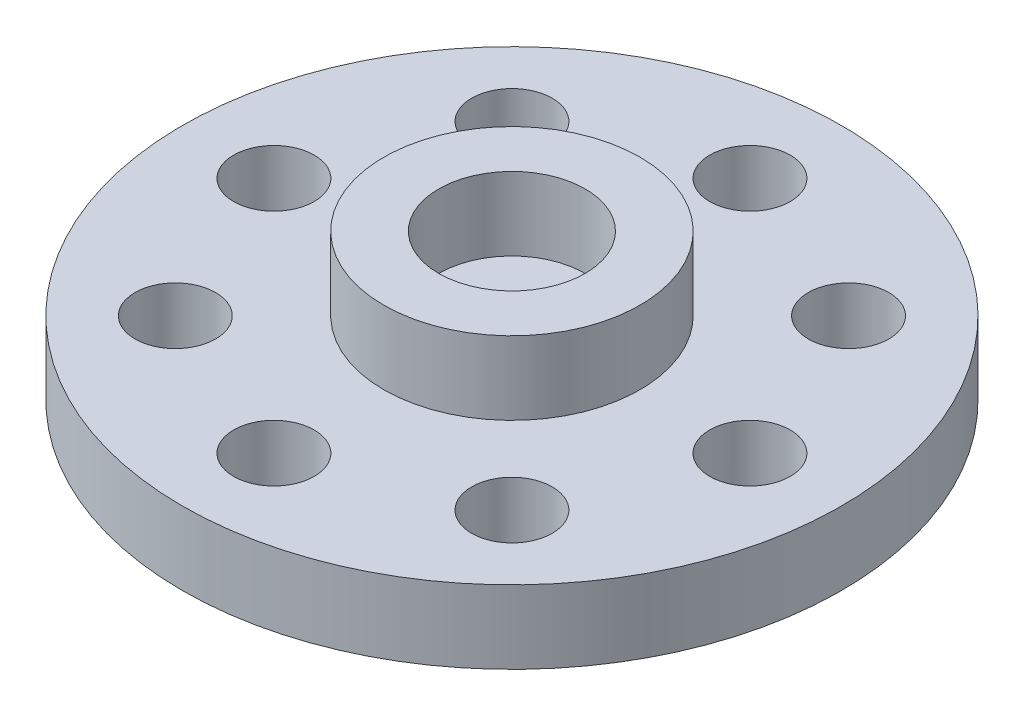
ISO-10303-21;
HEADER;
FILE_DESCRIPTION(('STEP AP214'),'2;1');
FILE_NAME('part.step','',(''),(''),'','','');
FILE_SCHEMA(('AUTOMOTIVE_DESIGN { 1 0 10303 214 1 1 1 1 }'));
ENDSEC;
DATA;
#1=APPLICATION_CONTEXT('core data for automotive mechanical design processes');
#2=APPLICATION_PROTOCOL_DEFINITION('international standard','automotive_design',2000,#1);
#3=PRODUCT_CONTEXT('',#1,'mechanical');
#4=PRODUCT('Part','Part','',(#3));
#5=PRODUCT_RELATED_PRODUCT_CATEGORY('part','',(#4));
#6=PRODUCT_DEFINITION_FORMATION('','',#4);
#7=PRODUCT_DEFINITION_CONTEXT('part definition',#1,'design');
#8=PRODUCT_DEFINITION('design','',#6,#7);
#9=PRODUCT_DEFINITION_SHAPE('','',#8);
#10=(LENGTH_UNIT() NAMED_UNIT(*) SI_UNIT(.MILLI.,.METRE.));
#11=(NAMED_UNIT(*) PLANE_ANGLE_UNIT() SI_UNIT($,.RADIAN.));
#12=(NAMED_UNIT(*) SI_UNIT($,.STERADIAN.) SOLID_ANGLE_UNIT());
#13=UNCERTAINTY_MEASURE_WITH_UNIT(LENGTH_MEASURE(1.E-05),#10,'distance_accuracy_value','');
#14=(GEOMETRIC_REPRESENTATION_CONTEXT(3) GLOBAL_UNCERTAINTY_ASSIGNED_CONTEXT((#13)) GLOBAL_UNIT_ASSIGNED_CONTEXT((#10,
#11,#12)) REPRESENTATION_CONTEXT('',''));
#15=CARTESIAN_POINT('',(0.,0.,0.));
#16=DIRECTION('',(0.,0.,1.));
#17=DIRECTION('',(1.,0.,0.));
#18=AXIS2_PLACEMENT_3D('',#15,#16,#17);
#19=CARTESIAN_POINT('',(0.,2.,0.));
#20=DIRECTION('',(0.,-1.,0.));
#21=DIRECTION('',(0.,0.,-1.));
#22=AXIS2_PLACEMENT_3D('',#19,#20,#21);
#23=CYLINDRICAL_SURFACE('',#22,9.);
#24=CARTESIAN_POINT('',(0.,2.,0.));
#25=DIRECTION('',(0.,1.,0.));
#26=DIRECTION('',(0.,0.,1.));
#27=AXIS2_PLACEMENT_3D('',#24,#25,#26);
#28=CIRCLE('',#27,9.);
#29=CARTESIAN_POINT('',(0.,2.,9.));
#30=VERTEX_POINT('',#29);
#31=EDGE_CURVE('E48',#30,#30,#28,.T.);
#32=ORIENTED_EDGE('',*,*,#31,.F.);
#33=EDGE_LOOP('',(#32));
#34=FACE_BOUND('',#33,.T.);
#35=CARTESIAN_POINT('',(0.,0.,0.));
#36=DIRECTION('',(0.,1.,0.));
#37=DIRECTION('',(0.,0.,1.));
#38=AXIS2_PLACEMENT_3D('',#35,#36,#37);
#39=CIRCLE('',#38,9.);
#40=CARTESIAN_POINT('',(0.,0.,9.));
#41=VERTEX_POINT('',#40);
#42=EDGE_CURVE('E53',#41,#41,#39,.T.);
#43=ORIENTED_EDGE('',*,*,#42,.T.);
#44=EDGE_LOOP('',(#43));
#45=FACE_BOUND('',#44,.T.);
#46=ADVANCED_FACE('F41',(#34,#45),#23,.T.);
#47=CARTESIAN_POINT('',(0.,2.,0.));
#48=DIRECTION('',(0.,1.,0.));
#49=DIRECTION('',(0.,0.,1.));
#50=AXIS2_PLACEMENT_3D('',#47,#48,#49);
#51=PLANE('',#50);
#52=CARTESIAN_POINT('',(-4.59619407771256,2.,4.59619407771256));
#53=DIRECTION('',(0.,1.,0.));
#54=DIRECTION('',(0.,0.,1.));
#55=AXIS2_PLACEMENT_3D('',#52,#53,#54);
#56=CIRCLE('',#55,1.1);
#57=CARTESIAN_POINT('',(-4.59619407771256,2.,5.69619407771256));
#58=VERTEX_POINT('',#57);
#59=EDGE_CURVE('E72',#58,#58,#56,.T.);
#60=ORIENTED_EDGE('',*,*,#59,.F.);
#61=EDGE_LOOP('',(#60));
#62=FACE_BOUND('',#61,.T.);
#63=CARTESIAN_POINT('',(-6.5,2.,0.));
#64=DIRECTION('',(0.,1.,0.));
#65=DIRECTION('',(0.,0.,1.));
#66=AXIS2_PLACEMENT_3D('',#63,#64,#65);
#67=CIRCLE('',#66,1.1);
#68=CARTESIAN_POINT('',(-6.5,2.,1.1));
#69=VERTEX_POINT('',#68);
#70=EDGE_CURVE('E76',#69,#69,#67,.T.);
#71=ORIENTED_EDGE('',*,*,#70,.F.);
#72=EDGE_LOOP('',(#71));
#73=FACE_BOUND('',#72,.T.);
#74=CARTESIAN_POINT('',(-4.59619407771256,2.,-4.59619407771256));
#75=DIRECTION('',(0.,1.,0.));
#76=DIRECTION('',(0.,0.,1.));
#77=AXIS2_PLACEMENT_3D('',#74,#75,#76);
#78=CIRCLE('',#77,1.1);
#79=CARTESIAN_POINT('',(-4.59619407771256,2.,-3.49619407771256));
#80=VERTEX_POINT('',#79);
#81=EDGE_CURVE('E80',#80,#80,#78,.T.);
#82=ORIENTED_EDGE('',*,*,#81,.F.);
#83=EDGE_LOOP('',(#82));
#84=FACE_BOUND('',#83,.T.);
#85=CARTESIAN_POINT('',(0.,2.,-6.5));
#86=DIRECTION('',(0.,1.,0.));
#87=DIRECTION('',(0.,0.,1.));
#88=AXIS2_PLACEMENT_3D('',#85,#86,#87);
#89=CIRCLE('',#88,1.1);
#90=CARTESIAN_POINT('',(0.,2.,-5.4));
#91=VERTEX_POINT('',#90);
#92=EDGE_CURVE('E84',#91,#91,#89,.T.);
#93=ORIENTED_EDGE('',*,*,#92,.F.);
#94=EDGE_LOOP('',(#93));
#95=FACE_BOUND('',#94,.T.);
#96=CARTESIAN_POINT('',(4.59619407771256,2.,-4.59619407771256));
#97=DIRECTION('',(0.,1.,0.));
#98=DIRECTION('',(0.,0.,1.));
#99=AXIS2_PLACEMENT_3D('',#96,#97,#98);
#100=CIRCLE('',#99,1.1);
#101=CARTESIAN_POINT('',(4.59619407771256,2.,-3.49619407771256));
#102=VERTEX_POINT('',#101);
#103=EDGE_CURVE('E88',#102,#102,#100,.T.);
#104=ORIENTED_EDGE('',*,*,#103,.F.);
#105=EDGE_LOOP('',(#104));
#106=FACE_BOUND('',#105,.T.);
#107=CARTESIAN_POINT('',(6.5,2.,0.));
#108=DIRECTION('',(0.,1.,0.));
#109=DIRECTION('',(0.,0.,1.));
#110=AXIS2_PLACEMENT_3D('',#107,#108,#109);
#111=CIRCLE('',#110,1.1);
#112=CARTESIAN_POINT('',(6.5,2.,1.1));
#113=VERTEX_POINT('',#112);
#114=EDGE_CURVE('E92',#113,#113,#111,.T.);
#115=ORIENTED_EDGE('',*,*,#114,.F.);
#116=EDGE_LOOP('',(#115));
#117=FACE_BOUND('',#116,.T.);
#118=CARTESIAN_POINT('',(4.59619407771256,2.,4.59619407771256));
#119=DIRECTION('',(0.,1.,0.));
#120=DIRECTION('',(0.,0.,1.));
#121=AXIS2_PLACEMENT_3D('',#118,#119,#120);
#122=CIRCLE('',#121,1.1);
#123=CARTESIAN_POINT('',(4.59619407771256,2.,5.69619407771256));
#124=VERTEX_POINT('',#123);
#125=EDGE_CURVE('E96',#124,#124,#122,.T.);
#126=ORIENTED_EDGE('',*,*,#125,.F.);
#127=EDGE_LOOP('',(#126));
#128=FACE_BOUND('',#127,.T.);
#129=CARTESIAN_POINT('',(0.,2.,6.5));
#130=DIRECTION('',(0.,1.,0.));
#131=DIRECTION('',(0.,0.,1.));
#132=AXIS2_PLACEMENT_3D('',#129,#130,#131);
#133=CIRCLE('',#132,1.1);
#134=CARTESIAN_POINT('',(0.,2.,7.6));
#135=VERTEX_POINT('',#134);
#136=EDGE_CURVE('E100',#135,#135,#133,.T.);
#137=ORIENTED_EDGE('',*,*,#136,.F.);
#138=EDGE_LOOP('',(#137));
#139=FACE_BOUND('',#138,.T.);
#140=CARTESIAN_POINT('',(0.,2.,0.));
#141=DIRECTION('',(0.,1.,0.));
#142=DIRECTION('',(0.,0.,1.));
#143=AXIS2_PLACEMENT_3D('',#140,#141,#142);
#144=CIRCLE('',#143,3.5);
#145=CARTESIAN_POINT('',(0.,2.,3.5));
#146=VERTEX_POINT('',#145);
#147=EDGE_CURVE('E61',#146,#146,#144,.T.);
#148=ORIENTED_EDGE('',*,*,#147,.F.);
#149=EDGE_LOOP('',(#148));
#150=FACE_BOUND('',#149,.T.);
#151=ORIENTED_EDGE('',*,*,#31,.T.);
#152=EDGE_LOOP('',(#151));
#153=FACE_BOUND('',#152,.T.);
#154=ADVANCED_FACE('F143',(#62,#73,#84,#95,#106,#117,#128,#139,#150,#153),#51,.T.);
#155=CARTESIAN_POINT('',(0.,0.,0.));
#156=DIRECTION('',(0.,1.,0.));
#157=DIRECTION('',(0.,0.,1.));
#158=AXIS2_PLACEMENT_3D('',#155,#156,#157);
#159=PLANE('',#158);
#160=CARTESIAN_POINT('',(-4.59619407771256,0.,4.59619407771256));
#161=DIRECTION('',(0.,-1.,0.));
#162=DIRECTION('',(0.,0.,-1.));
#163=AXIS2_PLACEMENT_3D('',#160,#161,#162);
#164=CIRCLE('',#163,1.1);
#165=CARTESIAN_POINT('',(-4.59619407771256,0.,3.49619407771256));
#166=VERTEX_POINT('',#165);
#167=EDGE_CURVE('E109',#166,#166,#164,.T.);
#168=ORIENTED_EDGE('',*,*,#167,.F.);
#169=EDGE_LOOP('',(#168));
#170=FACE_BOUND('',#169,.T.);
#171=CARTESIAN_POINT('',(-6.5,0.,0.));
#172=DIRECTION('',(0.,-1.,0.));
#173=DIRECTION('',(0.,0.,-1.));
#174=AXIS2_PLACEMENT_3D('',#171,#172,#173);
#175=CIRCLE('',#174,1.1);
#176=CARTESIAN_POINT('',(-6.5,0.,-1.1));
#177=VERTEX_POINT('',#176);
#178=EDGE_CURVE('E113',#177,#177,#175,.T.);
#179=ORIENTED_EDGE('',*,*,#178,.F.);
#180=EDGE_LOOP('',(#179));
#181=FACE_BOUND('',#180,.T.);
#182=CARTESIAN_POINT('',(-4.59619407771256,0.,-4.59619407771256));
#183=DIRECTION('',(0.,-1.,0.));
#184=DIRECTION('',(0.,0.,-1.));
#185=AXIS2_PLACEMENT_3D('',#182,#183,#184);
#186=CIRCLE('',#185,1.1);
#187=CARTESIAN_POINT('',(-4.59619407771256,0.,-5.69619407771256));
#188=VERTEX_POINT('',#187);
#189=EDGE_CURVE('E117',#188,#188,#186,.T.);
#190=ORIENTED_EDGE('',*,*,#189,.F.);
#191=EDGE_LOOP('',(#190));
#192=FACE_BOUND('',#191,.T.);
#193=CARTESIAN_POINT('',(0.,0.,-6.5));
#194=DIRECTION('',(0.,-1.,0.));
#195=DIRECTION('',(0.,0.,-1.));
#196=AXIS2_PLACEMENT_3D('',#193,#194,#195);
#197=CIRCLE('',#196,1.1);
#198=CARTESIAN_POINT('',(0.,0.,-7.6));
#199=VERTEX_POINT('',#198);
#200=EDGE_CURVE('E121',#199,#199,#197,.T.);
#201=ORIENTED_EDGE('',*,*,#200,.F.);
#202=EDGE_LOOP('',(#201));
#203=FACE_BOUND('',#202,.T.);
#204=CARTESIAN_POINT('',(4.59619407771256,0.,-4.59619407771256));
#205=DIRECTION('',(0.,-1.,0.));
#206=DIRECTION('',(0.,0.,-1.));
#207=AXIS2_PLACEMENT_3D('',#204,#205,#206);
#208=CIRCLE('',#207,1.1);
#209=CARTESIAN_POINT('',(4.59619407771256,0.,-5.69619407771256));
#210=VERTEX_POINT('',#209);
#211=EDGE_CURVE('E125',#210,#210,#208,.T.);
#212=ORIENTED_EDGE('',*,*,#211,.F.);
#213=EDGE_LOOP('',(#212));
#214=FACE_BOUND('',#213,.T.);
#215=CARTESIAN_POINT('',(6.5,0.,0.));
#216=DIRECTION('',(0.,-1.,0.));
#217=DIRECTION('',(0.,0.,-1.));
#218=AXIS2_PLACEMENT_3D('',#215,#216,#217);
#219=CIRCLE('',#218,1.1);
#220=CARTESIAN_POINT('',(6.5,0.,-1.1));
#221=VERTEX_POINT('',#220);
#222=EDGE_CURVE('E129',#221,#221,#219,.T.);
#223=ORIENTED_EDGE('',*,*,#222,.F.);
#224=EDGE_LOOP('',(#223));
#225=FACE_BOUND('',#224,.T.);
#226=CARTESIAN_POINT('',(4.59619407771256,0.,4.59619407771256));
#227=DIRECTION('',(0.,-1.,0.));
#228=DIRECTION('',(0.,0.,-1.));
#229=AXIS2_PLACEMENT_3D('',#226,#227,#228);
#230=CIRCLE('',#229,1.1);
#231=CARTESIAN_POINT('',(4.59619407771256,0.,3.49619407771256));
#232=VERTEX_POINT('',#231);
#233=EDGE_CURVE('E108',#232,#232,#230,.T.);
#234=ORIENTED_EDGE('',*,*,#233,.F.);
#235=EDGE_LOOP('',(#234));
#236=FACE_BOUND('',#235,.T.);
#237=CARTESIAN_POINT('',(0.,0.,6.5));
#238=DIRECTION('',(0.,-1.,0.));
#239=DIRECTION('',(0.,0.,-1.));
#240=AXIS2_PLACEMENT_3D('',#237,#238,#239);
#241=CIRCLE('',#240,1.1);
#242=CARTESIAN_POINT('',(0.,0.,5.4));
#243=VERTEX_POINT('',#242);
#244=EDGE_CURVE('E104',#243,#243,#241,.T.);
#245=ORIENTED_EDGE('',*,*,#244,.F.);
#246=EDGE_LOOP('',(#245));
#247=FACE_BOUND('',#246,.T.);
#248=ORIENTED_EDGE('',*,*,#42,.F.);
#249=EDGE_LOOP('',(#248));
#250=FACE_BOUND('',#249,.T.);
#251=ADVANCED_FACE('F139',(#170,#181,#192,#203,#214,#225,#236,#247,#250),#159,.F.);
#252=CARTESIAN_POINT('',(0.,4.,0.));
#253=DIRECTION('',(0.,1.,0.));
#254=DIRECTION('',(0.,0.,1.));
#255=AXIS2_PLACEMENT_3D('',#252,#253,#254);
#256=PLANE('',#255);
#257=CARTESIAN_POINT('',(0.,4.,0.));
#258=DIRECTION('',(0.,1.,0.));
#259=DIRECTION('',(0.,0.,1.));
#260=AXIS2_PLACEMENT_3D('',#257,#258,#259);
#261=CIRCLE('',#260,3.5);
#262=CARTESIAN_POINT('',(0.,4.,3.5));
#263=VERTEX_POINT('',#262);
#264=EDGE_CURVE('E59',#263,#263,#261,.T.);
#265=ORIENTED_EDGE('',*,*,#264,.T.);
#266=EDGE_LOOP('',(#265));
#267=FACE_BOUND('',#266,.T.);
#268=CARTESIAN_POINT('',(0.,4.,0.));
#269=DIRECTION('',(0.,1.,0.));
#270=DIRECTION('',(0.,0.,1.));
#271=AXIS2_PLACEMENT_3D('',#268,#269,#270);
#272=CIRCLE('',#271,2.);
#273=CARTESIAN_POINT('',(0.,4.,2.));
#274=VERTEX_POINT('',#273);
#275=EDGE_CURVE('E65',#274,#274,#272,.T.);
#276=ORIENTED_EDGE('',*,*,#275,.F.);
#277=EDGE_LOOP('',(#276));
#278=FACE_BOUND('',#277,.T.);
#279=ADVANCED_FACE('F142',(#267,#278),#256,.T.);
#280=CARTESIAN_POINT('',(0.,4.,0.));
#281=DIRECTION('',(0.,-1.,0.));
#282=DIRECTION('',(0.,0.,-1.));
#283=AXIS2_PLACEMENT_3D('',#280,#281,#282);
#284=CYLINDRICAL_SURFACE('',#283,3.5);
#285=ORIENTED_EDGE('',*,*,#264,.F.);
#286=EDGE_LOOP('',(#285));
#287=FACE_BOUND('',#286,.T.);
#288=ORIENTED_EDGE('',*,*,#147,.T.);
#289=EDGE_LOOP('',(#288));
#290=FACE_BOUND('',#289,.T.);
#291=ADVANCED_FACE('F172',(#287,#290),#284,.T.);
#292=CARTESIAN_POINT('',(0.,4.,0.));
#293=DIRECTION('',(0.,-1.,0.));
#294=DIRECTION('',(0.,0.,-1.));
#295=AXIS2_PLACEMENT_3D('',#292,#293,#294);
#296=CYLINDRICAL_SURFACE('',#295,2.);
#297=ORIENTED_EDGE('',*,*,#275,.T.);
#298=EDGE_LOOP('',(#297));
#299=FACE_BOUND('',#298,.T.);
#300=CARTESIAN_POINT('',(0.,2.,0.));
#301=DIRECTION('',(0.,1.,0.));
#302=DIRECTION('',(0.,0.,1.));
#303=AXIS2_PLACEMENT_3D('',#300,#301,#302);
#304=CIRCLE('',#303,2.);
#305=CARTESIAN_POINT('',(0.,2.,2.));
#306=VERTEX_POINT('',#305);
#307=EDGE_CURVE('E10',#306,#306,#304,.F.);
#308=ORIENTED_EDGE('',*,*,#307,.T.);
#309=EDGE_LOOP('',(#308));
#310=FACE_BOUND('',#309,.T.);
#311=ADVANCED_FACE('F164',(#299,#310),#296,.F.);
#312=ORIENTED_EDGE('',*,*,#307,.F.);
#313=EDGE_LOOP('',(#312));
#314=FACE_BOUND('',#313,.T.);
#315=ADVANCED_FACE('F156',(#314),#51,.T.);
#316=CARTESIAN_POINT('',(0.,4.,6.5));
#317=DIRECTION('',(0.,-1.,0.));
#318=DIRECTION('',(0.,0.,-1.));
#319=AXIS2_PLACEMENT_3D('',#316,#317,#318);
#320=CYLINDRICAL_SURFACE('',#319,1.1);
#321=ORIENTED_EDGE('',*,*,#136,.T.);
#322=EDGE_LOOP('',(#321));
#323=FACE_BOUND('',#322,.T.);
#324=ORIENTED_EDGE('',*,*,#244,.T.);
#325=EDGE_LOOP('',(#324));
#326=FACE_BOUND('',#325,.T.);
#327=ADVANCED_FACE('F163',(#323,#326),#320,.F.);
#328=CARTESIAN_POINT('',(4.59619407771256,4.,4.59619407771256));
#329=DIRECTION('',(0.,-1.,0.));
#330=DIRECTION('',(0.,0.,-1.));
#331=AXIS2_PLACEMENT_3D('',#328,#329,#330);
#332=CYLINDRICAL_SURFACE('',#331,1.1);
#333=ORIENTED_EDGE('',*,*,#125,.T.);
#334=EDGE_LOOP('',(#333));
#335=FACE_BOUND('',#334,.T.);
#336=ORIENTED_EDGE('',*,*,#233,.T.);
#337=EDGE_LOOP('',(#336));
#338=FACE_BOUND('',#337,.T.);
#339=ADVANCED_FACE('F137',(#335,#338),#332,.F.);
#340=CARTESIAN_POINT('',(6.5,4.,0.));
#341=DIRECTION('',(0.,-1.,0.));
#342=DIRECTION('',(0.,0.,-1.));
#343=AXIS2_PLACEMENT_3D('',#340,#341,#342);
#344=CYLINDRICAL_SURFACE('',#343,1.1);
#345=ORIENTED_EDGE('',*,*,#114,.T.);
#346=EDGE_LOOP('',(#345));
#347=FACE_BOUND('',#346,.T.);
#348=ORIENTED_EDGE('',*,*,#222,.T.);
#349=EDGE_LOOP('',(#348));
#350=FACE_BOUND('',#349,.T.);
#351=ADVANCED_FACE('F235',(#347,#350),#344,.F.);
#352=CARTESIAN_POINT('',(4.59619407771256,4.,-4.59619407771256));
#353=DIRECTION('',(0.,-1.,0.));
#354=DIRECTION('',(0.,0.,-1.));
#355=AXIS2_PLACEMENT_3D('',#352,#353,#354);
#356=CYLINDRICAL_SURFACE('',#355,1.1);
#357=ORIENTED_EDGE('',*,*,#103,.T.);
#358=EDGE_LOOP('',(#357));
#359=FACE_BOUND('',#358,.T.);
#360=ORIENTED_EDGE('',*,*,#211,.T.);
#361=EDGE_LOOP('',(#360));
#362=FACE_BOUND('',#361,.T.);
#363=ADVANCED_FACE('F246',(#359,#362),#356,.F.);
#364=CARTESIAN_POINT('',(0.,4.,-6.5));
#365=DIRECTION('',(0.,-1.,0.));
#366=DIRECTION('',(0.,0.,-1.));
#367=AXIS2_PLACEMENT_3D('',#364,#365,#366);
#368=CYLINDRICAL_SURFACE('',#367,1.1);
#369=ORIENTED_EDGE('',*,*,#92,.T.);
#370=EDGE_LOOP('',(#369));
#371=FACE_BOUND('',#370,.T.);
#372=ORIENTED_EDGE('',*,*,#200,.T.);
#373=EDGE_LOOP('',(#372));
#374=FACE_BOUND('',#373,.T.);
#375=ADVANCED_FACE('F257',(#371,#374),#368,.F.);
#376=CARTESIAN_POINT('',(-4.59619407771256,4.,-4.59619407771256));
#377=DIRECTION('',(0.,-1.,0.));
#378=DIRECTION('',(0.,0.,-1.));
#379=AXIS2_PLACEMENT_3D('',#376,#377,#378);
#380=CYLINDRICAL_SURFACE('',#379,1.1);
#381=ORIENTED_EDGE('',*,*,#81,.T.);
#382=EDGE_LOOP('',(#381));
#383=FACE_BOUND('',#382,.T.);
#384=ORIENTED_EDGE('',*,*,#189,.T.);
#385=EDGE_LOOP('',(#384));
#386=FACE_BOUND('',#385,.T.);
#387=ADVANCED_FACE('F268',(#383,#386),#380,.F.);
#388=CARTESIAN_POINT('',(-6.5,4.,0.));
#389=DIRECTION('',(0.,-1.,0.));
#390=DIRECTION('',(0.,0.,-1.));
#391=AXIS2_PLACEMENT_3D('',#388,#389,#390);
#392=CYLINDRICAL_SURFACE('',#391,1.1);
#393=ORIENTED_EDGE('',*,*,#70,.T.);
#394=EDGE_LOOP('',(#393));
#395=FACE_BOUND('',#394,.T.);
#396=ORIENTED_EDGE('',*,*,#178,.T.);
#397=EDGE_LOOP('',(#396));
#398=FACE_BOUND('',#397,.T.);
#399=ADVANCED_FACE('F279',(#395,#398),#392,.F.);
#400=CARTESIAN_POINT('',(-4.59619407771256,4.,4.59619407771256));
#401=DIRECTION('',(0.,-1.,0.));
#402=DIRECTION('',(0.,0.,-1.));
#403=AXIS2_PLACEMENT_3D('',#400,#401,#402);
#404=CYLINDRICAL_SURFACE('',#403,1.1);
#405=ORIENTED_EDGE('',*,*,#59,.T.);
#406=EDGE_LOOP('',(#405));
#407=FACE_BOUND('',#406,.T.);
#408=ORIENTED_EDGE('',*,*,#167,.T.);
#409=EDGE_LOOP('',(#408));
#410=FACE_BOUND('',#409,.T.);
#411=ADVANCED_FACE('F290',(#407,#410),#404,.F.);
#412=CLOSED_SHELL('',(#46,#154,#251,#279,#291,#311,#315,#327,#339,#351,#363,#375,#387,#399,#411));
#413=MANIFOLD_SOLID_BREP('B2',#412);
#414=ADVANCED_BREP_SHAPE_REPRESENTATION('',(#18,#413),#14);
#415=SHAPE_DEFINITION_REPRESENTATION(#9,#414);
ENDSEC;
END-ISO-10303-21;
